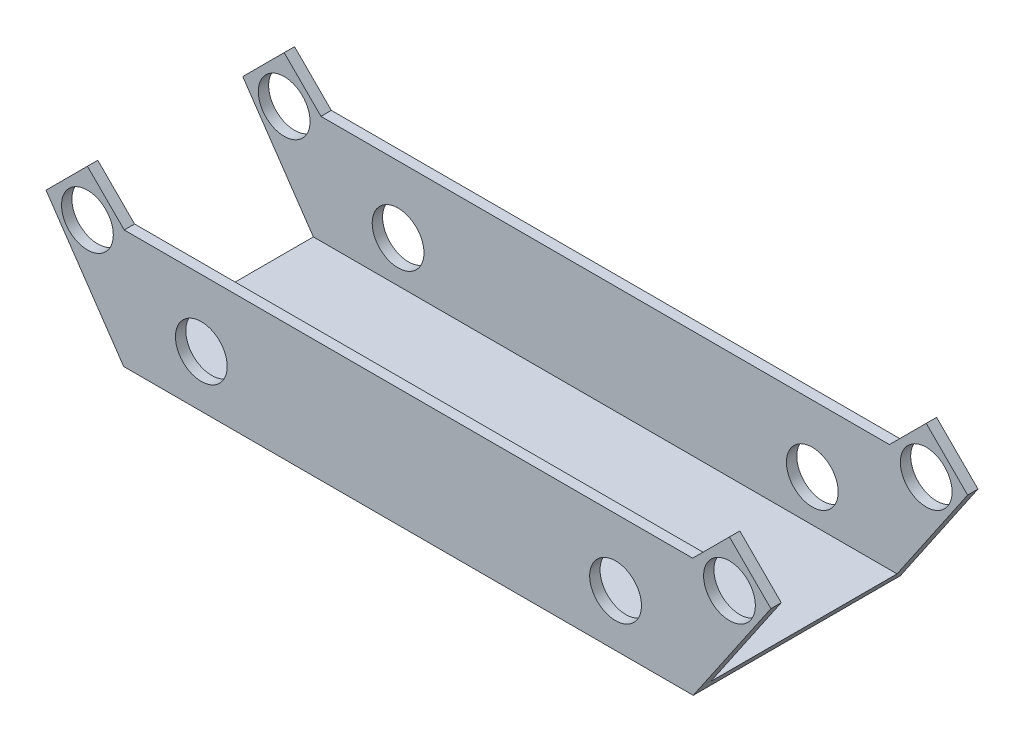
ISO-10303-21;
HEADER;
FILE_DESCRIPTION(('STEP AP214'),'2;1');
FILE_NAME('part.step','',(''),(''),'','','');
FILE_SCHEMA(('AUTOMOTIVE_DESIGN { 1 0 10303 214 1 1 1 1 }'));
ENDSEC;
DATA;
#1=APPLICATION_CONTEXT('core data for automotive mechanical design processes');
#2=APPLICATION_PROTOCOL_DEFINITION('international standard','automotive_design',2000,#1);
#3=PRODUCT_CONTEXT('',#1,'mechanical');
#4=PRODUCT('Part','Part','',(#3));
#5=PRODUCT_RELATED_PRODUCT_CATEGORY('part','',(#4));
#6=PRODUCT_DEFINITION_FORMATION('','',#4);
#7=PRODUCT_DEFINITION_CONTEXT('part definition',#1,'design');
#8=PRODUCT_DEFINITION('design','',#6,#7);
#9=PRODUCT_DEFINITION_SHAPE('','',#8);
#10=(LENGTH_UNIT() NAMED_UNIT(*) SI_UNIT(.MILLI.,.METRE.));
#11=(NAMED_UNIT(*) PLANE_ANGLE_UNIT() SI_UNIT($,.RADIAN.));
#12=(NAMED_UNIT(*) SI_UNIT($,.STERADIAN.) SOLID_ANGLE_UNIT());
#13=UNCERTAINTY_MEASURE_WITH_UNIT(LENGTH_MEASURE(1.E-05),#10,'distance_accuracy_value','');
#14=(GEOMETRIC_REPRESENTATION_CONTEXT(3) GLOBAL_UNCERTAINTY_ASSIGNED_CONTEXT((#13)) GLOBAL_UNIT_ASSIGNED_CONTEXT((#10,
#11,#12)) REPRESENTATION_CONTEXT('',''));
#15=CARTESIAN_POINT('',(0.,0.,0.));
#16=DIRECTION('',(0.,0.,1.));
#17=DIRECTION('',(1.,0.,0.));
#18=AXIS2_PLACEMENT_3D('',#15,#16,#17);
#19=CARTESIAN_POINT('',(0.,30.,0.));
#20=DIRECTION('',(0.,0.,-1.));
#21=DIRECTION('',(-1.,0.,0.));
#22=AXIS2_PLACEMENT_3D('',#19,#20,#21);
#23=PLANE('',#22);
#24=CARTESIAN_POINT('',(8.,21.,0.));
#25=DIRECTION('',(0.,0.,1.));
#26=DIRECTION('',(1.,0.,0.));
#27=AXIS2_PLACEMENT_3D('',#24,#25,#26);
#28=CIRCLE('',#27,5.);
#29=CARTESIAN_POINT('',(13.,21.,0.));
#30=VERTEX_POINT('',#29);
#31=EDGE_CURVE('E221',#30,#30,#28,.T.);
#32=ORIENTED_EDGE('',*,*,#31,.F.);
#33=EDGE_LOOP('',(#32));
#34=FACE_BOUND('',#33,.T.);
#35=CARTESIAN_POINT('',(30.,9.99999999999999,0.));
#36=DIRECTION('',(0.,0.,1.));
#37=DIRECTION('',(1.,0.,0.));
#38=AXIS2_PLACEMENT_3D('',#35,#36,#37);
#39=CIRCLE('',#38,5.);
#40=CARTESIAN_POINT('',(35.,9.99999999999999,0.));
#41=VERTEX_POINT('',#40);
#42=EDGE_CURVE('E420',#41,#41,#39,.T.);
#43=ORIENTED_EDGE('',*,*,#42,.F.);
#44=EDGE_LOOP('',(#43));
#45=FACE_BOUND('',#44,.T.);
#46=DIRECTION('',(1.,0.,0.));
#47=VECTOR('',#46,1.);
#48=CARTESIAN_POINT('',(0.,22.8927312722219,0.));
#49=LINE('',#48,#47);
#50=CARTESIAN_POINT('',(15.1072687277781,22.8927312722219,0.));
#51=VERTEX_POINT('',#50);
#52=CARTESIAN_POINT('',(124.892731272222,22.892731272222,0.));
#53=VERTEX_POINT('',#52);
#54=EDGE_CURVE('E226',#51,#53,#49,.T.);
#55=ORIENTED_EDGE('',*,*,#54,.F.);
#56=DIRECTION('',(0.707106781186548,-0.707106781186548,0.));
#57=VECTOR('',#56,1.);
#58=CARTESIAN_POINT('',(19.,19.,0.));
#59=LINE('',#58,#57);
#60=CARTESIAN_POINT('',(8.,30.,0.));
#61=VERTEX_POINT('',#60);
#62=EDGE_CURVE('E214',#61,#51,#59,.T.);
#63=ORIENTED_EDGE('',*,*,#62,.F.);
#64=DIRECTION('',(-0.707106781186547,-0.707106781186548,0.));
#65=VECTOR('',#64,1.);
#66=CARTESIAN_POINT('',(-11.,11.,0.));
#67=LINE('',#66,#65);
#68=CARTESIAN_POINT('',(0.,22.,0.));
#69=VERTEX_POINT('',#68);
#70=EDGE_CURVE('E279',#61,#69,#67,.T.);
#71=ORIENTED_EDGE('',*,*,#70,.T.);
#72=DIRECTION('',(-0.56333682464151,0.826227342807548,0.));
#73=VECTOR('',#72,1.);
#74=CARTESIAN_POINT('',(10.2397743300423,6.98166431593794,0.));
#75=LINE('',#74,#73);
#76=CARTESIAN_POINT('',(15.,0.,0.));
#77=VERTEX_POINT('',#76);
#78=EDGE_CURVE('E315',#77,#69,#75,.T.);
#79=ORIENTED_EDGE('',*,*,#78,.F.);
#80=DIRECTION('',(1.,0.,0.));
#81=VECTOR('',#80,1.);
#82=CARTESIAN_POINT('',(0.,0.,0.));
#83=LINE('',#82,#81);
#84=CARTESIAN_POINT('',(125.,0.,0.));
#85=VERTEX_POINT('',#84);
#86=EDGE_CURVE('E357',#77,#85,#83,.T.);
#87=ORIENTED_EDGE('',*,*,#86,.T.);
#88=DIRECTION('',(0.563336824641509,0.826227342807548,0.));
#89=VECTOR('',#88,1.);
#90=CARTESIAN_POINT('',(85.3314527503527,-58.1805359661495,0.));
#91=LINE('',#90,#89);
#92=CARTESIAN_POINT('',(140.,22.0000000000001,0.));
#93=VERTEX_POINT('',#92);
#94=EDGE_CURVE('E309',#85,#93,#91,.T.);
#95=ORIENTED_EDGE('',*,*,#94,.T.);
#96=DIRECTION('',(0.707106781186548,-0.707106781186547,0.));
#97=VECTOR('',#96,1.);
#98=CARTESIAN_POINT('',(80.9999999999999,81.,0.));
#99=LINE('',#98,#97);
#100=CARTESIAN_POINT('',(132.,30.,0.));
#101=VERTEX_POINT('',#100);
#102=EDGE_CURVE('E274',#101,#93,#99,.T.);
#103=ORIENTED_EDGE('',*,*,#102,.F.);
#104=DIRECTION('',(-0.707106781186549,-0.707106781186546,0.));
#105=VECTOR('',#104,1.);
#106=CARTESIAN_POINT('',(50.9999999999998,-51.,0.));
#107=LINE('',#106,#105);
#108=EDGE_CURVE('E218',#101,#53,#107,.T.);
#109=ORIENTED_EDGE('',*,*,#108,.T.);
#110=EDGE_LOOP('',(#55,#63,#71,#79,#87,#95,#103,#109));
#111=FACE_BOUND('',#110,.T.);
#112=CARTESIAN_POINT('',(132.,21.,0.));
#113=DIRECTION('',(0.,0.,1.));
#114=DIRECTION('',(1.,0.,0.));
#115=AXIS2_PLACEMENT_3D('',#112,#113,#114);
#116=CIRCLE('',#115,4.99999999999999);
#117=CARTESIAN_POINT('',(137.,21.,0.));
#118=VERTEX_POINT('',#117);
#119=EDGE_CURVE('E427',#118,#118,#116,.F.);
#120=ORIENTED_EDGE('',*,*,#119,.T.);
#121=EDGE_LOOP('',(#120));
#122=FACE_BOUND('',#121,.T.);
#123=CARTESIAN_POINT('',(110.,10.,0.));
#124=DIRECTION('',(0.,0.,1.));
#125=DIRECTION('',(1.,0.,0.));
#126=AXIS2_PLACEMENT_3D('',#123,#124,#125);
#127=CIRCLE('',#126,4.99999999999999);
#128=CARTESIAN_POINT('',(115.,10.,0.));
#129=VERTEX_POINT('',#128);
#130=EDGE_CURVE('E430',#129,#129,#127,.F.);
#131=ORIENTED_EDGE('',*,*,#130,.T.);
#132=EDGE_LOOP('',(#131));
#133=FACE_BOUND('',#132,.T.);
#134=ADVANCED_FACE('F69',(#34,#45,#111,#122,#133),#23,.F.);
#135=CARTESIAN_POINT('',(0.,30.,-40.));
#136=DIRECTION('',(0.,0.,1.));
#137=DIRECTION('',(1.,0.,0.));
#138=AXIS2_PLACEMENT_3D('',#135,#136,#137);
#139=PLANE('',#138);
#140=CARTESIAN_POINT('',(8.,21.,-40.));
#141=DIRECTION('',(0.,0.,1.));
#142=DIRECTION('',(1.,0.,0.));
#143=AXIS2_PLACEMENT_3D('',#140,#141,#142);
#144=CIRCLE('',#143,5.);
#145=CARTESIAN_POINT('',(13.,21.,-40.));
#146=VERTEX_POINT('',#145);
#147=EDGE_CURVE('E445',#146,#146,#144,.T.);
#148=ORIENTED_EDGE('',*,*,#147,.T.);
#149=EDGE_LOOP('',(#148));
#150=FACE_BOUND('',#149,.T.);
#151=CARTESIAN_POINT('',(30.,9.99999999999999,-40.));
#152=DIRECTION('',(0.,0.,1.));
#153=DIRECTION('',(1.,0.,0.));
#154=AXIS2_PLACEMENT_3D('',#151,#152,#153);
#155=CIRCLE('',#154,5.);
#156=CARTESIAN_POINT('',(35.,9.99999999999999,-40.));
#157=VERTEX_POINT('',#156);
#158=EDGE_CURVE('E434',#157,#157,#155,.T.);
#159=ORIENTED_EDGE('',*,*,#158,.T.);
#160=EDGE_LOOP('',(#159));
#161=FACE_BOUND('',#160,.T.);
#162=DIRECTION('',(-0.707106781186547,-0.707106781186548,0.));
#163=VECTOR('',#162,1.);
#164=CARTESIAN_POINT('',(-11.,11.,-40.));
#165=LINE('',#164,#163);
#166=CARTESIAN_POINT('',(8.,30.,-40.));
#167=VERTEX_POINT('',#166);
#168=CARTESIAN_POINT('',(0.,22.,-40.));
#169=VERTEX_POINT('',#168);
#170=EDGE_CURVE('E275',#167,#169,#165,.T.);
#171=ORIENTED_EDGE('',*,*,#170,.F.);
#172=DIRECTION('',(0.707106781186548,-0.707106781186548,0.));
#173=VECTOR('',#172,1.);
#174=CARTESIAN_POINT('',(19.,19.,-40.));
#175=LINE('',#174,#173);
#176=CARTESIAN_POINT('',(15.1072687277781,22.8927312722219,-40.));
#177=VERTEX_POINT('',#176);
#178=EDGE_CURVE('E198',#167,#177,#175,.T.);
#179=ORIENTED_EDGE('',*,*,#178,.T.);
#180=DIRECTION('',(1.,0.,0.));
#181=VECTOR('',#180,1.);
#182=CARTESIAN_POINT('',(0.,22.8927312722219,-40.));
#183=LINE('',#182,#181);
#184=CARTESIAN_POINT('',(124.892731272222,22.892731272222,-40.));
#185=VERTEX_POINT('',#184);
#186=EDGE_CURVE('E199',#177,#185,#183,.T.);
#187=ORIENTED_EDGE('',*,*,#186,.T.);
#188=DIRECTION('',(-0.707106781186549,-0.707106781186546,0.));
#189=VECTOR('',#188,1.);
#190=CARTESIAN_POINT('',(50.9999999999998,-51.,-40.));
#191=LINE('',#190,#189);
#192=CARTESIAN_POINT('',(132.,30.,-40.));
#193=VERTEX_POINT('',#192);
#194=EDGE_CURVE('E186',#193,#185,#191,.T.);
#195=ORIENTED_EDGE('',*,*,#194,.F.);
#196=DIRECTION('',(0.707106781186548,-0.707106781186547,0.));
#197=VECTOR('',#196,1.);
#198=CARTESIAN_POINT('',(80.9999999999999,81.,-40.));
#199=LINE('',#198,#197);
#200=CARTESIAN_POINT('',(140.,22.0000000000001,-40.));
#201=VERTEX_POINT('',#200);
#202=EDGE_CURVE('E287',#193,#201,#199,.T.);
#203=ORIENTED_EDGE('',*,*,#202,.T.);
#204=DIRECTION('',(0.563336824641509,0.826227342807548,0.));
#205=VECTOR('',#204,1.);
#206=CARTESIAN_POINT('',(85.3314527503527,-58.1805359661495,-40.));
#207=LINE('',#206,#205);
#208=CARTESIAN_POINT('',(125.,0.,-40.));
#209=VERTEX_POINT('',#208);
#210=EDGE_CURVE('E326',#209,#201,#207,.T.);
#211=ORIENTED_EDGE('',*,*,#210,.F.);
#212=DIRECTION('',(-1.,0.,0.));
#213=VECTOR('',#212,1.);
#214=CARTESIAN_POINT('',(0.,0.,-40.));
#215=LINE('',#214,#213);
#216=CARTESIAN_POINT('',(15.,0.,-40.));
#217=VERTEX_POINT('',#216);
#218=EDGE_CURVE('E364',#209,#217,#215,.T.);
#219=ORIENTED_EDGE('',*,*,#218,.T.);
#220=DIRECTION('',(-0.56333682464151,0.826227342807548,0.));
#221=VECTOR('',#220,1.);
#222=CARTESIAN_POINT('',(10.2397743300423,6.98166431593794,-40.));
#223=LINE('',#222,#221);
#224=EDGE_CURVE('E310',#217,#169,#223,.T.);
#225=ORIENTED_EDGE('',*,*,#224,.T.);
#226=EDGE_LOOP('',(#171,#179,#187,#195,#203,#211,#219,#225));
#227=FACE_BOUND('',#226,.T.);
#228=CARTESIAN_POINT('',(132.,21.,-40.));
#229=DIRECTION('',(0.,0.,1.));
#230=DIRECTION('',(1.,0.,0.));
#231=AXIS2_PLACEMENT_3D('',#228,#229,#230);
#232=CIRCLE('',#231,4.99999999999999);
#233=CARTESIAN_POINT('',(137.,21.,-40.));
#234=VERTEX_POINT('',#233);
#235=EDGE_CURVE('E230',#234,#234,#232,.F.);
#236=ORIENTED_EDGE('',*,*,#235,.F.);
#237=EDGE_LOOP('',(#236));
#238=FACE_BOUND('',#237,.T.);
#239=CARTESIAN_POINT('',(110.,10.,-40.));
#240=DIRECTION('',(0.,0.,1.));
#241=DIRECTION('',(1.,0.,0.));
#242=AXIS2_PLACEMENT_3D('',#239,#240,#241);
#243=CIRCLE('',#242,4.99999999999999);
#244=CARTESIAN_POINT('',(115.,10.,-40.));
#245=VERTEX_POINT('',#244);
#246=EDGE_CURVE('E433',#245,#245,#243,.F.);
#247=ORIENTED_EDGE('',*,*,#246,.F.);
#248=EDGE_LOOP('',(#247));
#249=FACE_BOUND('',#248,.T.);
#250=ADVANCED_FACE('F211',(#150,#161,#227,#238,#249),#139,.F.);
#251=CARTESIAN_POINT('',(0.,2.,-2.0000000000001));
#252=DIRECTION('',(0.,0.,1.));
#253=DIRECTION('',(1.,0.,0.));
#254=AXIS2_PLACEMENT_3D('',#251,#252,#253);
#255=PLANE('',#254);
#256=CARTESIAN_POINT('',(8.,21.,-2.0000000000001));
#257=DIRECTION('',(0.,0.,1.));
#258=DIRECTION('',(1.,0.,0.));
#259=AXIS2_PLACEMENT_3D('',#256,#257,#258);
#260=CIRCLE('',#259,5.);
#261=CARTESIAN_POINT('',(13.,21.,-2.0000000000001));
#262=VERTEX_POINT('',#261);
#263=EDGE_CURVE('E270',#262,#262,#260,.T.);
#264=ORIENTED_EDGE('',*,*,#263,.T.);
#265=EDGE_LOOP('',(#264));
#266=FACE_BOUND('',#265,.T.);
#267=CARTESIAN_POINT('',(30.,9.99999999999999,-2.0000000000001));
#268=DIRECTION('',(0.,0.,1.));
#269=DIRECTION('',(1.,0.,0.));
#270=AXIS2_PLACEMENT_3D('',#267,#268,#269);
#271=CIRCLE('',#270,5.);
#272=CARTESIAN_POINT('',(35.,9.99999999999999,-2.0000000000001));
#273=VERTEX_POINT('',#272);
#274=EDGE_CURVE('E266',#273,#273,#271,.T.);
#275=ORIENTED_EDGE('',*,*,#274,.T.);
#276=EDGE_LOOP('',(#275));
#277=FACE_BOUND('',#276,.T.);
#278=DIRECTION('',(-0.707106781186547,-0.707106781186548,0.));
#279=VECTOR('',#278,1.);
#280=CARTESIAN_POINT('',(-10.,12.,-2.0000000000001));
#281=LINE('',#280,#279);
#282=CARTESIAN_POINT('',(8.,30.,-2.00000000000011));
#283=VERTEX_POINT('',#282);
#284=CARTESIAN_POINT('',(0.,22.,-2.0000000000001));
#285=VERTEX_POINT('',#284);
#286=EDGE_CURVE('E298',#283,#285,#281,.T.);
#287=ORIENTED_EDGE('',*,*,#286,.F.);
#288=DIRECTION('',(0.707106781186548,-0.707106781186548,0.));
#289=VECTOR('',#288,1.);
#290=CARTESIAN_POINT('',(18.,20.,-2.0000000000001));
#291=LINE('',#290,#289);
#292=CARTESIAN_POINT('',(15.1072687277781,22.8927312722219,-2.0000000000001));
#293=VERTEX_POINT('',#292);
#294=EDGE_CURVE('E247',#283,#293,#291,.T.);
#295=ORIENTED_EDGE('',*,*,#294,.T.);
#296=DIRECTION('',(1.,0.,0.));
#297=VECTOR('',#296,1.);
#298=CARTESIAN_POINT('',(0.,22.8927312722219,-2.0000000000001));
#299=LINE('',#298,#297);
#300=CARTESIAN_POINT('',(124.892731272222,22.892731272222,-2.0000000000001));
#301=VERTEX_POINT('',#300);
#302=EDGE_CURVE('E251',#293,#301,#299,.T.);
#303=ORIENTED_EDGE('',*,*,#302,.T.);
#304=DIRECTION('',(-0.707106781186549,-0.707106781186546,0.));
#305=VECTOR('',#304,1.);
#306=CARTESIAN_POINT('',(51.9999999999998,-50.,-2.0000000000001));
#307=LINE('',#306,#305);
#308=CARTESIAN_POINT('',(132.,30.,-2.0000000000001));
#309=VERTEX_POINT('',#308);
#310=EDGE_CURVE('E240',#309,#301,#307,.T.);
#311=ORIENTED_EDGE('',*,*,#310,.F.);
#312=DIRECTION('',(0.707106781186548,-0.707106781186547,0.));
#313=VECTOR('',#312,1.);
#314=CARTESIAN_POINT('',(79.9999999999999,82.,-2.0000000000001));
#315=LINE('',#314,#313);
#316=CARTESIAN_POINT('',(140.,22.0000000000001,-2.0000000000001));
#317=VERTEX_POINT('',#316);
#318=EDGE_CURVE('E305',#309,#317,#315,.T.);
#319=ORIENTED_EDGE('',*,*,#318,.T.);
#320=DIRECTION('',(0.563336824641509,0.826227342807548,0.));
#321=VECTOR('',#320,1.);
#322=CARTESIAN_POINT('',(86.2623413258111,-56.8152327221439,-2.0000000000001));
#323=LINE('',#322,#321);
#324=CARTESIAN_POINT('',(126.363636363636,2.,-2.0000000000001));
#325=VERTEX_POINT('',#324);
#326=EDGE_CURVE('E342',#325,#317,#323,.T.);
#327=ORIENTED_EDGE('',*,*,#326,.F.);
#328=DIRECTION('',(1.,0.,0.));
#329=VECTOR('',#328,1.);
#330=CARTESIAN_POINT('',(0.,2.,-2.0000000000001));
#331=LINE('',#330,#329);
#332=CARTESIAN_POINT('',(13.6363636363636,2.,-2.0000000000001));
#333=VERTEX_POINT('',#332);
#334=EDGE_CURVE('E352',#333,#325,#331,.T.);
#335=ORIENTED_EDGE('',*,*,#334,.F.);
#336=DIRECTION('',(-0.56333682464151,0.826227342807548,0.));
#337=VECTOR('',#336,1.);
#338=CARTESIAN_POINT('',(9.30888575458391,8.34696755994359,-2.0000000000001));
#339=LINE('',#338,#337);
#340=EDGE_CURVE('E86',#333,#285,#339,.T.);
#341=ORIENTED_EDGE('',*,*,#340,.T.);
#342=EDGE_LOOP('',(#287,#295,#303,#311,#319,#327,#335,#341));
#343=FACE_BOUND('',#342,.T.);
#344=CARTESIAN_POINT('',(132.,21.,-2.0000000000001));
#345=DIRECTION('',(0.,0.,1.));
#346=DIRECTION('',(1.,0.,0.));
#347=AXIS2_PLACEMENT_3D('',#344,#345,#346);
#348=CIRCLE('',#347,4.99999999999999);
#349=CARTESIAN_POINT('',(137.,21.,-2.0000000000001));
#350=VERTEX_POINT('',#349);
#351=EDGE_CURVE('E256',#350,#350,#348,.F.);
#352=ORIENTED_EDGE('',*,*,#351,.F.);
#353=EDGE_LOOP('',(#352));
#354=FACE_BOUND('',#353,.T.);
#355=CARTESIAN_POINT('',(110.,10.,-2.0000000000001));
#356=DIRECTION('',(0.,0.,1.));
#357=DIRECTION('',(1.,0.,0.));
#358=AXIS2_PLACEMENT_3D('',#355,#356,#357);
#359=CIRCLE('',#358,4.99999999999999);
#360=CARTESIAN_POINT('',(115.,10.,-2.0000000000001));
#361=VERTEX_POINT('',#360);
#362=EDGE_CURVE('E261',#361,#361,#359,.F.);
#363=ORIENTED_EDGE('',*,*,#362,.F.);
#364=EDGE_LOOP('',(#363));
#365=FACE_BOUND('',#364,.T.);
#366=ADVANCED_FACE('F412',(#266,#277,#343,#354,#365),#255,.F.);
#367=CARTESIAN_POINT('',(0.,2.,-38.0000000000001));
#368=DIRECTION('',(0.,0.,-1.));
#369=DIRECTION('',(-1.,0.,0.));
#370=AXIS2_PLACEMENT_3D('',#367,#368,#369);
#371=PLANE('',#370);
#372=CARTESIAN_POINT('',(8.,21.,-38.0000000000001));
#373=DIRECTION('',(0.,0.,-1.));
#374=DIRECTION('',(-1.,0.,0.));
#375=AXIS2_PLACEMENT_3D('',#372,#373,#374);
#376=CIRCLE('',#375,5.);
#377=CARTESIAN_POINT('',(3.,21.,-38.0000000000001));
#378=VERTEX_POINT('',#377);
#379=EDGE_CURVE('E72',#378,#378,#376,.T.);
#380=ORIENTED_EDGE('',*,*,#379,.T.);
#381=EDGE_LOOP('',(#380));
#382=FACE_BOUND('',#381,.T.);
#383=CARTESIAN_POINT('',(30.,9.99999999999999,-38.0000000000001));
#384=DIRECTION('',(0.,0.,-1.));
#385=DIRECTION('',(-1.,0.,0.));
#386=AXIS2_PLACEMENT_3D('',#383,#384,#385);
#387=CIRCLE('',#386,5.);
#388=CARTESIAN_POINT('',(25.,9.99999999999999,-38.0000000000001));
#389=VERTEX_POINT('',#388);
#390=EDGE_CURVE('E265',#389,#389,#387,.T.);
#391=ORIENTED_EDGE('',*,*,#390,.T.);
#392=EDGE_LOOP('',(#391));
#393=FACE_BOUND('',#392,.T.);
#394=DIRECTION('',(-1.,0.,0.));
#395=VECTOR('',#394,1.);
#396=CARTESIAN_POINT('',(0.,22.8927312722219,-38.0000000000001));
#397=LINE('',#396,#395);
#398=CARTESIAN_POINT('',(124.892731272222,22.892731272222,-38.0000000000001));
#399=VERTEX_POINT('',#398);
#400=CARTESIAN_POINT('',(15.1072687277781,22.8927312722219,-38.0000000000001));
#401=VERTEX_POINT('',#400);
#402=EDGE_CURVE('E12',#399,#401,#397,.T.);
#403=ORIENTED_EDGE('',*,*,#402,.T.);
#404=DIRECTION('',(-0.707106781186548,0.707106781186548,0.));
#405=VECTOR('',#404,1.);
#406=CARTESIAN_POINT('',(18.,20.,-38.0000000000001));
#407=LINE('',#406,#405);
#408=CARTESIAN_POINT('',(8.,30.,-38.0000000000001));
#409=VERTEX_POINT('',#408);
#410=EDGE_CURVE('E243',#401,#409,#407,.T.);
#411=ORIENTED_EDGE('',*,*,#410,.T.);
#412=DIRECTION('',(0.707106781186547,0.707106781186548,0.));
#413=VECTOR('',#412,1.);
#414=CARTESIAN_POINT('',(-10.,12.,-38.0000000000001));
#415=LINE('',#414,#413);
#416=CARTESIAN_POINT('',(0.,22.,-38.0000000000001));
#417=VERTEX_POINT('',#416);
#418=EDGE_CURVE('E286',#417,#409,#415,.T.);
#419=ORIENTED_EDGE('',*,*,#418,.F.);
#420=DIRECTION('',(0.56333682464151,-0.826227342807548,0.));
#421=VECTOR('',#420,1.);
#422=CARTESIAN_POINT('',(9.30888575458391,8.34696755994359,-38.0000000000001));
#423=LINE('',#422,#421);
#424=CARTESIAN_POINT('',(13.6363636363636,2.,-38.0000000000001));
#425=VERTEX_POINT('',#424);
#426=EDGE_CURVE('E346',#417,#425,#423,.T.);
#427=ORIENTED_EDGE('',*,*,#426,.T.);
#428=DIRECTION('',(1.,0.,0.));
#429=VECTOR('',#428,1.);
#430=CARTESIAN_POINT('',(0.,2.,-38.0000000000001));
#431=LINE('',#430,#429);
#432=CARTESIAN_POINT('',(126.363636363636,2.,-38.0000000000001));
#433=VERTEX_POINT('',#432);
#434=EDGE_CURVE('E353',#425,#433,#431,.T.);
#435=ORIENTED_EDGE('',*,*,#434,.T.);
#436=DIRECTION('',(-0.563336824641509,-0.826227342807548,0.));
#437=VECTOR('',#436,1.);
#438=CARTESIAN_POINT('',(86.2623413258111,-56.8152327221439,-38.0000000000001));
#439=LINE('',#438,#437);
#440=CARTESIAN_POINT('',(140.,22.0000000000001,-38.0000000000001));
#441=VERTEX_POINT('',#440);
#442=EDGE_CURVE('E94',#441,#433,#439,.T.);
#443=ORIENTED_EDGE('',*,*,#442,.F.);
#444=DIRECTION('',(-0.707106781186548,0.707106781186547,0.));
#445=VECTOR('',#444,1.);
#446=CARTESIAN_POINT('',(79.9999999999999,82.,-38.0000000000001));
#447=LINE('',#446,#445);
#448=CARTESIAN_POINT('',(132.,30.,-38.0000000000001));
#449=VERTEX_POINT('',#448);
#450=EDGE_CURVE('E301',#441,#449,#447,.T.);
#451=ORIENTED_EDGE('',*,*,#450,.T.);
#452=DIRECTION('',(0.707106781186549,0.707106781186546,0.));
#453=VECTOR('',#452,1.);
#454=CARTESIAN_POINT('',(51.9999999999998,-50.,-38.0000000000001));
#455=LINE('',#454,#453);
#456=EDGE_CURVE('E236',#399,#449,#455,.T.);
#457=ORIENTED_EDGE('',*,*,#456,.F.);
#458=EDGE_LOOP('',(#403,#411,#419,#427,#435,#443,#451,#457));
#459=FACE_BOUND('',#458,.T.);
#460=CARTESIAN_POINT('',(132.,21.,-38.0000000000001));
#461=DIRECTION('',(0.,0.,-1.));
#462=DIRECTION('',(-1.,0.,0.));
#463=AXIS2_PLACEMENT_3D('',#460,#461,#462);
#464=CIRCLE('',#463,4.99999999999999);
#465=CARTESIAN_POINT('',(127.,21.,-38.0000000000001));
#466=VERTEX_POINT('',#465);
#467=EDGE_CURVE('E255',#466,#466,#464,.F.);
#468=ORIENTED_EDGE('',*,*,#467,.F.);
#469=EDGE_LOOP('',(#468));
#470=FACE_BOUND('',#469,.T.);
#471=CARTESIAN_POINT('',(110.,10.,-38.0000000000001));
#472=DIRECTION('',(0.,0.,-1.));
#473=DIRECTION('',(-1.,0.,0.));
#474=AXIS2_PLACEMENT_3D('',#471,#472,#473);
#475=CIRCLE('',#474,4.99999999999999);
#476=CARTESIAN_POINT('',(105.,10.,-38.0000000000001));
#477=VERTEX_POINT('',#476);
#478=EDGE_CURVE('E260',#477,#477,#475,.F.);
#479=ORIENTED_EDGE('',*,*,#478,.F.);
#480=EDGE_LOOP('',(#479));
#481=FACE_BOUND('',#480,.T.);
#482=ADVANCED_FACE('F382',(#382,#393,#459,#470,#481),#371,.F.);
#483=CARTESIAN_POINT('',(0.,0.,0.));
#484=DIRECTION('',(0.,-1.,0.));
#485=DIRECTION('',(0.,0.,-1.));
#486=AXIS2_PLACEMENT_3D('',#483,#484,#485);
#487=PLANE('',#486);
#488=DIRECTION('',(0.,0.,1.));
#489=VECTOR('',#488,1.);
#490=CARTESIAN_POINT('',(15.,0.,-40.));
#491=LINE('',#490,#489);
#492=EDGE_CURVE('E314',#217,#77,#491,.T.);
#493=ORIENTED_EDGE('',*,*,#492,.F.);
#494=ORIENTED_EDGE('',*,*,#218,.F.);
#495=DIRECTION('',(0.,0.,1.));
#496=VECTOR('',#495,1.);
#497=CARTESIAN_POINT('',(125.,0.,-40.));
#498=LINE('',#497,#496);
#499=EDGE_CURVE('E330',#209,#85,#498,.T.);
#500=ORIENTED_EDGE('',*,*,#499,.T.);
#501=ORIENTED_EDGE('',*,*,#86,.F.);
#502=EDGE_LOOP('',(#493,#494,#500,#501));
#503=FACE_BOUND('',#502,.T.);
#504=ADVANCED_FACE('F490',(#503),#487,.T.);
#505=CARTESIAN_POINT('',(0.,2.,-2.0000000000001));
#506=DIRECTION('',(0.,-1.,0.));
#507=DIRECTION('',(0.,0.,-1.));
#508=AXIS2_PLACEMENT_3D('',#505,#506,#507);
#509=PLANE('',#508);
#510=ORIENTED_EDGE('',*,*,#434,.F.);
#511=DIRECTION('',(0.,0.,1.));
#512=VECTOR('',#511,1.);
#513=CARTESIAN_POINT('',(13.6363636363636,2.,-2.0000000000001));
#514=LINE('',#513,#512);
#515=EDGE_CURVE('E78',#425,#333,#514,.T.);
#516=ORIENTED_EDGE('',*,*,#515,.T.);
#517=ORIENTED_EDGE('',*,*,#334,.T.);
#518=DIRECTION('',(0.,0.,1.));
#519=VECTOR('',#518,1.);
#520=CARTESIAN_POINT('',(126.363636363636,2.,-2.0000000000001));
#521=LINE('',#520,#519);
#522=EDGE_CURVE('E368',#433,#325,#521,.T.);
#523=ORIENTED_EDGE('',*,*,#522,.F.);
#524=EDGE_LOOP('',(#510,#516,#517,#523));
#525=FACE_BOUND('',#524,.T.);
#526=ADVANCED_FACE('F498',(#525),#509,.F.);
#527=CARTESIAN_POINT('',(85.3314527503527,-58.1805359661495,-40.));
#528=DIRECTION('',(0.826227342807548,-0.563336824641509,0.));
#529=DIRECTION('',(0.563336824641509,0.826227342807548,0.));
#530=AXIS2_PLACEMENT_3D('',#527,#528,#529);
#531=PLANE('',#530);
#532=ORIENTED_EDGE('',*,*,#326,.T.);
#533=DIRECTION('',(0.,0.,1.));
#534=VECTOR('',#533,1.);
#535=CARTESIAN_POINT('',(140.,22.0000000000001,-40.));
#536=LINE('',#535,#534);
#537=EDGE_CURVE('E336',#317,#93,#536,.T.);
#538=ORIENTED_EDGE('',*,*,#537,.T.);
#539=ORIENTED_EDGE('',*,*,#94,.F.);
#540=ORIENTED_EDGE('',*,*,#499,.F.);
#541=ORIENTED_EDGE('',*,*,#210,.T.);
#542=EDGE_CURVE('E319',#201,#441,#536,.T.);
#543=ORIENTED_EDGE('',*,*,#542,.T.);
#544=ORIENTED_EDGE('',*,*,#442,.T.);
#545=ORIENTED_EDGE('',*,*,#522,.T.);
#546=EDGE_LOOP('',(#532,#538,#539,#540,#541,#543,#544,#545));
#547=FACE_BOUND('',#546,.T.);
#548=ADVANCED_FACE('F504',(#547),#531,.T.);
#549=CARTESIAN_POINT('',(10.2397743300423,6.98166431593794,-40.));
#550=DIRECTION('',(0.826227342807548,0.56333682464151,0.));
#551=DIRECTION('',(-0.56333682464151,0.826227342807548,0.));
#552=AXIS2_PLACEMENT_3D('',#549,#550,#551);
#553=PLANE('',#552);
#554=ORIENTED_EDGE('',*,*,#515,.F.);
#555=ORIENTED_EDGE('',*,*,#426,.F.);
#556=DIRECTION('',(0.,0.,1.));
#557=VECTOR('',#556,1.);
#558=CARTESIAN_POINT('',(0.,22.,-40.));
#559=LINE('',#558,#557);
#560=EDGE_CURVE('E320',#169,#417,#559,.T.);
#561=ORIENTED_EDGE('',*,*,#560,.F.);
#562=ORIENTED_EDGE('',*,*,#224,.F.);
#563=ORIENTED_EDGE('',*,*,#492,.T.);
#564=ORIENTED_EDGE('',*,*,#78,.T.);
#565=EDGE_CURVE('E323',#285,#69,#559,.T.);
#566=ORIENTED_EDGE('',*,*,#565,.F.);
#567=ORIENTED_EDGE('',*,*,#340,.F.);
#568=EDGE_LOOP('',(#554,#555,#561,#562,#563,#564,#566,#567));
#569=FACE_BOUND('',#568,.T.);
#570=ADVANCED_FACE('F511',(#569),#553,.F.);
#571=CARTESIAN_POINT('',(-11.,11.,-40.));
#572=DIRECTION('',(-0.707106781186548,0.707106781186547,0.));
#573=DIRECTION('',(-0.707106781186547,-0.707106781186548,0.));
#574=AXIS2_PLACEMENT_3D('',#571,#572,#573);
#575=PLANE('',#574);
#576=ORIENTED_EDGE('',*,*,#286,.T.);
#577=ORIENTED_EDGE('',*,*,#565,.T.);
#578=ORIENTED_EDGE('',*,*,#70,.F.);
#579=DIRECTION('',(0.,0.,1.));
#580=VECTOR('',#579,1.);
#581=CARTESIAN_POINT('',(8.,30.,-40.));
#582=LINE('',#581,#580);
#583=EDGE_CURVE('E278',#283,#61,#582,.T.);
#584=ORIENTED_EDGE('',*,*,#583,.F.);
#585=EDGE_LOOP('',(#576,#577,#578,#584));
#586=FACE_BOUND('',#585,.T.);
#587=ADVANCED_FACE('F526',(#586),#575,.T.);
#588=ORIENTED_EDGE('',*,*,#418,.T.);
#589=EDGE_CURVE('E283',#167,#409,#582,.T.);
#590=ORIENTED_EDGE('',*,*,#589,.F.);
#591=ORIENTED_EDGE('',*,*,#170,.T.);
#592=ORIENTED_EDGE('',*,*,#560,.T.);
#593=EDGE_LOOP('',(#588,#590,#591,#592));
#594=FACE_BOUND('',#593,.T.);
#595=ADVANCED_FACE('F567',(#594),#575,.T.);
#596=CARTESIAN_POINT('',(80.9999999999999,81.,-40.));
#597=DIRECTION('',(-0.707106781186547,-0.707106781186548,0.));
#598=DIRECTION('',(0.707106781186548,-0.707106781186547,0.));
#599=AXIS2_PLACEMENT_3D('',#596,#597,#598);
#600=PLANE('',#599);
#601=ORIENTED_EDGE('',*,*,#542,.F.);
#602=ORIENTED_EDGE('',*,*,#202,.F.);
#603=DIRECTION('',(0.,0.,1.));
#604=VECTOR('',#603,1.);
#605=CARTESIAN_POINT('',(132.,30.,-40.));
#606=LINE('',#605,#604);
#607=EDGE_CURVE('E192',#193,#449,#606,.T.);
#608=ORIENTED_EDGE('',*,*,#607,.T.);
#609=ORIENTED_EDGE('',*,*,#450,.F.);
#610=EDGE_LOOP('',(#601,#602,#608,#609));
#611=FACE_BOUND('',#610,.T.);
#612=ADVANCED_FACE('F565',(#611),#600,.F.);
#613=EDGE_CURVE('E290',#309,#101,#606,.T.);
#614=ORIENTED_EDGE('',*,*,#613,.T.);
#615=ORIENTED_EDGE('',*,*,#102,.T.);
#616=ORIENTED_EDGE('',*,*,#537,.F.);
#617=ORIENTED_EDGE('',*,*,#318,.F.);
#618=EDGE_LOOP('',(#614,#615,#616,#617));
#619=FACE_BOUND('',#618,.T.);
#620=ADVANCED_FACE('F539',(#619),#600,.F.);
#621=CARTESIAN_POINT('',(50.9999999999998,-51.,-40.));
#622=DIRECTION('',(-0.707106781186546,0.707106781186549,0.));
#623=DIRECTION('',(-0.707106781186549,-0.707106781186546,0.));
#624=AXIS2_PLACEMENT_3D('',#621,#622,#623);
#625=PLANE('',#624);
#626=ORIENTED_EDGE('',*,*,#310,.T.);
#627=DIRECTION('',(0.,0.,1.));
#628=VECTOR('',#627,1.);
#629=CARTESIAN_POINT('',(124.892731272222,22.892731272222,-40.));
#630=LINE('',#629,#628);
#631=EDGE_CURVE('E208',#301,#53,#630,.T.);
#632=ORIENTED_EDGE('',*,*,#631,.T.);
#633=ORIENTED_EDGE('',*,*,#108,.F.);
#634=ORIENTED_EDGE('',*,*,#613,.F.);
#635=EDGE_LOOP('',(#626,#632,#633,#634));
#636=FACE_BOUND('',#635,.T.);
#637=ADVANCED_FACE('F482',(#636),#625,.T.);
#638=CARTESIAN_POINT('',(19.,19.,-40.));
#639=DIRECTION('',(-0.707106781186548,-0.707106781186548,0.));
#640=DIRECTION('',(0.707106781186548,-0.707106781186548,0.));
#641=AXIS2_PLACEMENT_3D('',#638,#639,#640);
#642=PLANE('',#641);
#643=ORIENTED_EDGE('',*,*,#583,.T.);
#644=ORIENTED_EDGE('',*,*,#62,.T.);
#645=DIRECTION('',(0.,0.,1.));
#646=VECTOR('',#645,1.);
#647=CARTESIAN_POINT('',(15.1072687277781,22.8927312722219,-40.));
#648=LINE('',#647,#646);
#649=EDGE_CURVE('E207',#293,#51,#648,.T.);
#650=ORIENTED_EDGE('',*,*,#649,.F.);
#651=ORIENTED_EDGE('',*,*,#294,.F.);
#652=EDGE_LOOP('',(#643,#644,#650,#651));
#653=FACE_BOUND('',#652,.T.);
#654=ADVANCED_FACE('F550',(#653),#642,.F.);
#655=CARTESIAN_POINT('',(0.,22.8927312722219,-40.));
#656=DIRECTION('',(0.,-1.,0.));
#657=DIRECTION('',(1.,0.,0.));
#658=AXIS2_PLACEMENT_3D('',#655,#656,#657);
#659=PLANE('',#658);
#660=ORIENTED_EDGE('',*,*,#649,.T.);
#661=ORIENTED_EDGE('',*,*,#54,.T.);
#662=ORIENTED_EDGE('',*,*,#631,.F.);
#663=ORIENTED_EDGE('',*,*,#302,.F.);
#664=EDGE_LOOP('',(#660,#661,#662,#663));
#665=FACE_BOUND('',#664,.T.);
#666=ADVANCED_FACE('F545',(#665),#659,.F.);
#667=EDGE_CURVE('E189',#185,#399,#630,.T.);
#668=ORIENTED_EDGE('',*,*,#667,.F.);
#669=ORIENTED_EDGE('',*,*,#186,.F.);
#670=EDGE_CURVE('E234',#177,#401,#648,.T.);
#671=ORIENTED_EDGE('',*,*,#670,.T.);
#672=ORIENTED_EDGE('',*,*,#402,.F.);
#673=EDGE_LOOP('',(#668,#669,#671,#672));
#674=FACE_BOUND('',#673,.T.);
#675=ADVANCED_FACE('F203',(#674),#659,.F.);
#676=ORIENTED_EDGE('',*,*,#670,.F.);
#677=ORIENTED_EDGE('',*,*,#178,.F.);
#678=ORIENTED_EDGE('',*,*,#589,.T.);
#679=ORIENTED_EDGE('',*,*,#410,.F.);
#680=EDGE_LOOP('',(#676,#677,#678,#679));
#681=FACE_BOUND('',#680,.T.);
#682=ADVANCED_FACE('F480',(#681),#642,.F.);
#683=ORIENTED_EDGE('',*,*,#456,.T.);
#684=ORIENTED_EDGE('',*,*,#607,.F.);
#685=ORIENTED_EDGE('',*,*,#194,.T.);
#686=ORIENTED_EDGE('',*,*,#667,.T.);
#687=EDGE_LOOP('',(#683,#684,#685,#686));
#688=FACE_BOUND('',#687,.T.);
#689=ADVANCED_FACE('F188',(#688),#625,.T.);
#690=CARTESIAN_POINT('',(132.,21.,-40.));
#691=DIRECTION('',(0.,0.,1.));
#692=DIRECTION('',(1.,0.,0.));
#693=AXIS2_PLACEMENT_3D('',#690,#691,#692);
#694=CYLINDRICAL_SURFACE('',#693,4.99999999999999);
#695=ORIENTED_EDGE('',*,*,#235,.T.);
#696=EDGE_LOOP('',(#695));
#697=FACE_BOUND('',#696,.T.);
#698=ORIENTED_EDGE('',*,*,#467,.T.);
#699=EDGE_LOOP('',(#698));
#700=FACE_BOUND('',#699,.T.);
#701=ADVANCED_FACE('F400',(#697,#700),#694,.F.);
#702=CARTESIAN_POINT('',(110.,10.,-40.));
#703=DIRECTION('',(0.,0.,1.));
#704=DIRECTION('',(1.,0.,0.));
#705=AXIS2_PLACEMENT_3D('',#702,#703,#704);
#706=CYLINDRICAL_SURFACE('',#705,4.99999999999999);
#707=ORIENTED_EDGE('',*,*,#246,.T.);
#708=EDGE_LOOP('',(#707));
#709=FACE_BOUND('',#708,.T.);
#710=ORIENTED_EDGE('',*,*,#478,.T.);
#711=EDGE_LOOP('',(#710));
#712=FACE_BOUND('',#711,.T.);
#713=ADVANCED_FACE('F388',(#709,#712),#706,.F.);
#714=CARTESIAN_POINT('',(30.,9.99999999999999,-40.));
#715=DIRECTION('',(0.,0.,1.));
#716=DIRECTION('',(1.,0.,0.));
#717=AXIS2_PLACEMENT_3D('',#714,#715,#716);
#718=CYLINDRICAL_SURFACE('',#717,5.);
#719=ORIENTED_EDGE('',*,*,#158,.F.);
#720=EDGE_LOOP('',(#719));
#721=FACE_BOUND('',#720,.T.);
#722=ORIENTED_EDGE('',*,*,#390,.F.);
#723=EDGE_LOOP('',(#722));
#724=FACE_BOUND('',#723,.T.);
#725=ADVANCED_FACE('F385',(#721,#724),#718,.F.);
#726=CARTESIAN_POINT('',(8.,21.,-40.));
#727=DIRECTION('',(0.,0.,1.));
#728=DIRECTION('',(1.,0.,0.));
#729=AXIS2_PLACEMENT_3D('',#726,#727,#728);
#730=CYLINDRICAL_SURFACE('',#729,5.);
#731=ORIENTED_EDGE('',*,*,#147,.F.);
#732=EDGE_LOOP('',(#731));
#733=FACE_BOUND('',#732,.T.);
#734=ORIENTED_EDGE('',*,*,#379,.F.);
#735=EDGE_LOOP('',(#734));
#736=FACE_BOUND('',#735,.T.);
#737=ADVANCED_FACE('F387',(#733,#736),#730,.F.);
#738=ORIENTED_EDGE('',*,*,#119,.F.);
#739=EDGE_LOOP('',(#738));
#740=FACE_BOUND('',#739,.T.);
#741=ORIENTED_EDGE('',*,*,#351,.T.);
#742=EDGE_LOOP('',(#741));
#743=FACE_BOUND('',#742,.T.);
#744=ADVANCED_FACE('F396',(#740,#743),#694,.F.);
#745=ORIENTED_EDGE('',*,*,#130,.F.);
#746=EDGE_LOOP('',(#745));
#747=FACE_BOUND('',#746,.T.);
#748=ORIENTED_EDGE('',*,*,#362,.T.);
#749=EDGE_LOOP('',(#748));
#750=FACE_BOUND('',#749,.T.);
#751=ADVANCED_FACE('F403',(#747,#750),#706,.F.);
#752=ORIENTED_EDGE('',*,*,#42,.T.);
#753=EDGE_LOOP('',(#752));
#754=FACE_BOUND('',#753,.T.);
#755=ORIENTED_EDGE('',*,*,#274,.F.);
#756=EDGE_LOOP('',(#755));
#757=FACE_BOUND('',#756,.T.);
#758=ADVANCED_FACE('F391',(#754,#757),#718,.F.);
#759=ORIENTED_EDGE('',*,*,#31,.T.);
#760=EDGE_LOOP('',(#759));
#761=FACE_BOUND('',#760,.T.);
#762=ORIENTED_EDGE('',*,*,#263,.F.);
#763=EDGE_LOOP('',(#762));
#764=FACE_BOUND('',#763,.T.);
#765=ADVANCED_FACE('F399',(#761,#764),#730,.F.);
#766=CLOSED_SHELL('',(#134,#250,#366,#482,#504,#526,#548,#570,#587,#595,#612,#620,#637,#654,
#666,#675,#682,#689,#701,#713,#725,#737,#744,#751,#758,#765));
#767=MANIFOLD_SOLID_BREP('B2',#766);
#768=ADVANCED_BREP_SHAPE_REPRESENTATION('',(#18,#767),#14);
#769=SHAPE_DEFINITION_REPRESENTATION(#9,#768);
ENDSEC;
END-ISO-10303-21;
